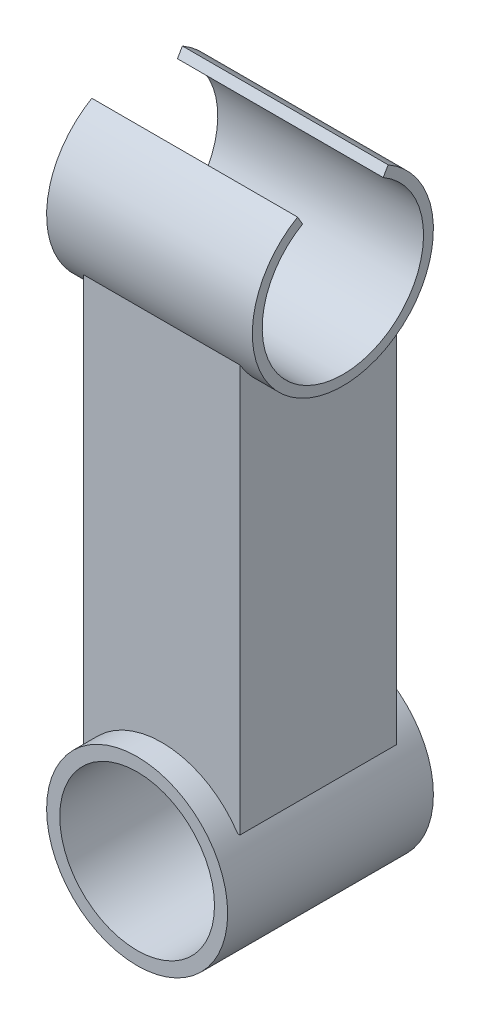
ISO-10303-21;
HEADER;
FILE_DESCRIPTION(('STEP AP214'),'2;1');
FILE_NAME('part.step','',(''),(''),'','','');
FILE_SCHEMA(('AUTOMOTIVE_DESIGN { 1 0 10303 214 1 1 1 1 }'));
ENDSEC;
DATA;
#1=APPLICATION_CONTEXT('core data for automotive mechanical design processes');
#2=APPLICATION_PROTOCOL_DEFINITION('international standard','automotive_design',2000,#1);
#3=PRODUCT_CONTEXT('',#1,'mechanical');
#4=PRODUCT('Part','Part','',(#3));
#5=PRODUCT_RELATED_PRODUCT_CATEGORY('part','',(#4));
#6=PRODUCT_DEFINITION_FORMATION('','',#4);
#7=PRODUCT_DEFINITION_CONTEXT('part definition',#1,'design');
#8=PRODUCT_DEFINITION('design','',#6,#7);
#9=PRODUCT_DEFINITION_SHAPE('','',#8);
#10=(LENGTH_UNIT() NAMED_UNIT(*) SI_UNIT(.MILLI.,.METRE.));
#11=(NAMED_UNIT(*) PLANE_ANGLE_UNIT() SI_UNIT($,.RADIAN.));
#12=(NAMED_UNIT(*) SI_UNIT($,.STERADIAN.) SOLID_ANGLE_UNIT());
#13=UNCERTAINTY_MEASURE_WITH_UNIT(LENGTH_MEASURE(1.E-05),#10,'distance_accuracy_value','');
#14=(GEOMETRIC_REPRESENTATION_CONTEXT(3) GLOBAL_UNCERTAINTY_ASSIGNED_CONTEXT((#13)) GLOBAL_UNIT_ASSIGNED_CONTEXT((#10,
#11,#12)) REPRESENTATION_CONTEXT('',''));
#15=CARTESIAN_POINT('',(0.,0.,0.));
#16=DIRECTION('',(0.,0.,1.));
#17=DIRECTION('',(1.,0.,0.));
#18=AXIS2_PLACEMENT_3D('',#15,#16,#17);
#19=CARTESIAN_POINT('',(0.,-55.,0.));
#20=DIRECTION('',(0.,-1.,0.));
#21=DIRECTION('',(0.,0.,-1.));
#22=AXIS2_PLACEMENT_3D('',#19,#20,#21);
#23=PLANE('',#22);
#24=DIRECTION('',(-1.,0.,0.));
#25=VECTOR('',#24,1.);
#26=CARTESIAN_POINT('',(-9.5,-55.,-9.5));
#27=LINE('',#26,#25);
#28=CARTESIAN_POINT('',(-9.21954445729289,-55.,-9.5));
#29=VERTEX_POINT('',#28);
#30=CARTESIAN_POINT('',(-9.5,-55.,-9.5));
#31=VERTEX_POINT('',#30);
#32=EDGE_CURVE('E332',#29,#31,#27,.T.);
#33=ORIENTED_EDGE('',*,*,#32,.F.);
#34=DIRECTION('',(0.,0.,-1.));
#35=VECTOR('',#34,1.);
#36=CARTESIAN_POINT('',(-9.21954445729289,-55.,12.5));
#37=LINE('',#36,#35);
#38=CARTESIAN_POINT('',(-9.21954445729289,-55.,9.5));
#39=VERTEX_POINT('',#38);
#40=EDGE_CURVE('E11',#29,#39,#37,.F.);
#41=ORIENTED_EDGE('',*,*,#40,.T.);
#42=DIRECTION('',(1.,0.,0.));
#43=VECTOR('',#42,1.);
#44=CARTESIAN_POINT('',(-9.5,-55.,9.5));
#45=LINE('',#44,#43);
#46=CARTESIAN_POINT('',(-9.5,-55.,9.5));
#47=VERTEX_POINT('',#46);
#48=EDGE_CURVE('E166',#47,#39,#45,.T.);
#49=ORIENTED_EDGE('',*,*,#48,.F.);
#50=DIRECTION('',(0.,0.,1.));
#51=VECTOR('',#50,1.);
#52=CARTESIAN_POINT('',(-9.5,-55.,9.5));
#53=LINE('',#52,#51);
#54=EDGE_CURVE('E175',#31,#47,#53,.T.);
#55=ORIENTED_EDGE('',*,*,#54,.F.);
#56=EDGE_LOOP('',(#33,#41,#49,#55));
#57=FACE_BOUND('',#56,.T.);
#58=ADVANCED_FACE('F44',(#57),#23,.T.);
#59=CARTESIAN_POINT('',(9.21954445729289,-55.,9.5));
#60=VERTEX_POINT('',#59);
#61=CARTESIAN_POINT('',(9.5,-55.,9.5));
#62=VERTEX_POINT('',#61);
#63=EDGE_CURVE('E163',#60,#62,#45,.T.);
#64=ORIENTED_EDGE('',*,*,#63,.F.);
#65=DIRECTION('',(0.,0.,-1.));
#66=VECTOR('',#65,1.);
#67=CARTESIAN_POINT('',(9.21954445729289,-55.,12.5));
#68=LINE('',#67,#66);
#69=CARTESIAN_POINT('',(9.21954445729289,-55.,-9.5));
#70=VERTEX_POINT('',#69);
#71=EDGE_CURVE('E54',#60,#70,#68,.T.);
#72=ORIENTED_EDGE('',*,*,#71,.T.);
#73=CARTESIAN_POINT('',(9.5,-55.,-9.5));
#74=VERTEX_POINT('',#73);
#75=EDGE_CURVE('E181',#74,#70,#27,.T.);
#76=ORIENTED_EDGE('',*,*,#75,.F.);
#77=DIRECTION('',(0.,0.,-1.));
#78=VECTOR('',#77,1.);
#79=CARTESIAN_POINT('',(9.5,-55.,9.5));
#80=LINE('',#79,#78);
#81=EDGE_CURVE('E173',#62,#74,#80,.T.);
#82=ORIENTED_EDGE('',*,*,#81,.F.);
#83=EDGE_LOOP('',(#64,#72,#76,#82));
#84=FACE_BOUND('',#83,.T.);
#85=ADVANCED_FACE('F171',(#84),#23,.T.);
#86=CARTESIAN_POINT('',(12.5,0.,0.));
#87=DIRECTION('',(-1.,0.,0.));
#88=DIRECTION('',(0.,0.,1.));
#89=AXIS2_PLACEMENT_3D('',#86,#87,#88);
#90=CYLINDRICAL_SURFACE('',#89,11.);
#91=DIRECTION('',(-1.,0.,0.));
#92=VECTOR('',#91,1.);
#93=CARTESIAN_POINT('',(12.5,-5.54526825320471,9.5));
#94=LINE('',#93,#92);
#95=CARTESIAN_POINT('',(-9.5,-5.54526825320471,9.5));
#96=VERTEX_POINT('',#95);
#97=CARTESIAN_POINT('',(9.5,-5.54526825320471,9.5));
#98=VERTEX_POINT('',#97);
#99=EDGE_CURVE('E222',#96,#98,#94,.F.);
#100=ORIENTED_EDGE('',*,*,#99,.T.);
#101=CARTESIAN_POINT('',(9.5,0.,0.));
#102=DIRECTION('',(1.,0.,0.));
#103=DIRECTION('',(0.,0.,-1.));
#104=AXIS2_PLACEMENT_3D('',#101,#102,#103);
#105=CIRCLE('',#104,11.);
#106=CARTESIAN_POINT('',(9.5,-5.54526825320471,-9.5));
#107=VERTEX_POINT('',#106);
#108=EDGE_CURVE('E226',#98,#107,#105,.T.);
#109=ORIENTED_EDGE('',*,*,#108,.T.);
#110=DIRECTION('',(-1.,0.,0.));
#111=VECTOR('',#110,1.);
#112=CARTESIAN_POINT('',(12.5,-5.54526825320471,-9.5));
#113=LINE('',#112,#111);
#114=CARTESIAN_POINT('',(-9.5,-5.54526825320471,-9.5));
#115=VERTEX_POINT('',#114);
#116=EDGE_CURVE('E214',#107,#115,#113,.T.);
#117=ORIENTED_EDGE('',*,*,#116,.T.);
#118=CARTESIAN_POINT('',(-9.5,0.,0.));
#119=DIRECTION('',(-1.,0.,0.));
#120=DIRECTION('',(0.,0.,1.));
#121=AXIS2_PLACEMENT_3D('',#118,#119,#120);
#122=CIRCLE('',#121,11.);
#123=EDGE_CURVE('E218',#115,#96,#122,.T.);
#124=ORIENTED_EDGE('',*,*,#123,.T.);
#125=EDGE_LOOP('',(#100,#109,#117,#124));
#126=FACE_BOUND('',#125,.T.);
#127=CARTESIAN_POINT('',(-12.5,0.,0.));
#128=DIRECTION('',(1.,0.,0.));
#129=DIRECTION('',(0.,0.,-1.));
#130=AXIS2_PLACEMENT_3D('',#127,#128,#129);
#131=CIRCLE('',#130,11.);
#132=CARTESIAN_POINT('',(-12.5,9.52627944162886,5.49999999999994));
#133=VERTEX_POINT('',#132);
#134=CARTESIAN_POINT('',(-12.5,9.52627944162882,-5.50000000000001));
#135=VERTEX_POINT('',#134);
#136=EDGE_CURVE('E230',#133,#135,#131,.T.);
#137=ORIENTED_EDGE('',*,*,#136,.T.);
#138=DIRECTION('',(-1.,0.,0.));
#139=VECTOR('',#138,1.);
#140=CARTESIAN_POINT('',(12.5,9.52627944162882,-5.50000000000001));
#141=LINE('',#140,#139);
#142=CARTESIAN_POINT('',(12.5,9.52627944162882,-5.50000000000001));
#143=VERTEX_POINT('',#142);
#144=EDGE_CURVE('E158',#143,#135,#141,.T.);
#145=ORIENTED_EDGE('',*,*,#144,.F.);
#146=CARTESIAN_POINT('',(12.5,0.,0.));
#147=DIRECTION('',(1.,0.,0.));
#148=DIRECTION('',(0.,0.,-1.));
#149=AXIS2_PLACEMENT_3D('',#146,#147,#148);
#150=CIRCLE('',#149,11.);
#151=CARTESIAN_POINT('',(12.5,9.52627944162886,5.49999999999994));
#152=VERTEX_POINT('',#151);
#153=EDGE_CURVE('E231',#152,#143,#150,.T.);
#154=ORIENTED_EDGE('',*,*,#153,.F.);
#155=DIRECTION('',(-1.,0.,0.));
#156=VECTOR('',#155,1.);
#157=CARTESIAN_POINT('',(12.5,9.52627944162886,5.49999999999994));
#158=LINE('',#157,#156);
#159=EDGE_CURVE('E245',#152,#133,#158,.T.);
#160=ORIENTED_EDGE('',*,*,#159,.T.);
#161=EDGE_LOOP('',(#137,#145,#154,#160));
#162=FACE_BOUND('',#161,.T.);
#163=ADVANCED_FACE('F46',(#126,#162),#90,.T.);
#164=CARTESIAN_POINT('',(12.5,8.48704895708749,-4.90000000000001));
#165=DIRECTION('',(0.,-0.500000000000001,-0.866025403784438));
#166=DIRECTION('',(0.,0.866025403784438,-0.500000000000001));
#167=AXIS2_PLACEMENT_3D('',#164,#165,#166);
#168=PLANE('',#167);
#169=DIRECTION('',(0.,-0.866025403784438,0.500000000000001));
#170=VECTOR('',#169,1.);
#171=CARTESIAN_POINT('',(-12.5,8.48704895708749,-4.90000000000001));
#172=LINE('',#171,#170);
#173=CARTESIAN_POINT('',(-12.5,8.48704895708749,-4.90000000000001));
#174=VERTEX_POINT('',#173);
#175=EDGE_CURVE('E249',#135,#174,#172,.T.);
#176=ORIENTED_EDGE('',*,*,#175,.T.);
#177=DIRECTION('',(-1.,0.,0.));
#178=VECTOR('',#177,1.);
#179=CARTESIAN_POINT('',(12.5,8.48704895708749,-4.90000000000001));
#180=LINE('',#179,#178);
#181=CARTESIAN_POINT('',(12.5,8.48704895708749,-4.90000000000001));
#182=VERTEX_POINT('',#181);
#183=EDGE_CURVE('E264',#182,#174,#180,.T.);
#184=ORIENTED_EDGE('',*,*,#183,.F.);
#185=DIRECTION('',(0.,-0.866025403784438,0.500000000000001));
#186=VECTOR('',#185,1.);
#187=CARTESIAN_POINT('',(12.5,8.48704895708749,-4.90000000000001));
#188=LINE('',#187,#186);
#189=EDGE_CURVE('E235',#143,#182,#188,.T.);
#190=ORIENTED_EDGE('',*,*,#189,.F.);
#191=ORIENTED_EDGE('',*,*,#144,.T.);
#192=EDGE_LOOP('',(#176,#184,#190,#191));
#193=FACE_BOUND('',#192,.T.);
#194=ADVANCED_FACE('F272',(#193),#168,.F.);
#195=CARTESIAN_POINT('',(12.5,0.,0.));
#196=DIRECTION('',(-1.,0.,0.));
#197=DIRECTION('',(0.,0.,1.));
#198=AXIS2_PLACEMENT_3D('',#195,#196,#197);
#199=CYLINDRICAL_SURFACE('',#198,9.8);
#200=CARTESIAN_POINT('',(-12.5,0.,0.));
#201=DIRECTION('',(-1.,0.,0.));
#202=DIRECTION('',(0.,0.,-1.));
#203=AXIS2_PLACEMENT_3D('',#200,#201,#202);
#204=CIRCLE('',#203,9.8);
#205=CARTESIAN_POINT('',(-12.5,8.48704895708753,4.89999999999995));
#206=VERTEX_POINT('',#205);
#207=EDGE_CURVE('E252',#174,#206,#204,.T.);
#208=ORIENTED_EDGE('',*,*,#207,.T.);
#209=DIRECTION('',(-1.,0.,0.));
#210=VECTOR('',#209,1.);
#211=CARTESIAN_POINT('',(12.5,8.48704895708753,4.89999999999995));
#212=LINE('',#211,#210);
#213=CARTESIAN_POINT('',(12.5,8.48704895708753,4.89999999999995));
#214=VERTEX_POINT('',#213);
#215=EDGE_CURVE('E260',#214,#206,#212,.T.);
#216=ORIENTED_EDGE('',*,*,#215,.F.);
#217=CARTESIAN_POINT('',(12.5,0.,0.));
#218=DIRECTION('',(-1.,0.,0.));
#219=DIRECTION('',(0.,0.,-1.));
#220=AXIS2_PLACEMENT_3D('',#217,#218,#219);
#221=CIRCLE('',#220,9.8);
#222=EDGE_CURVE('E239',#182,#214,#221,.T.);
#223=ORIENTED_EDGE('',*,*,#222,.F.);
#224=ORIENTED_EDGE('',*,*,#183,.T.);
#225=EDGE_LOOP('',(#208,#216,#223,#224));
#226=FACE_BOUND('',#225,.T.);
#227=ADVANCED_FACE('F284',(#226),#199,.F.);
#228=CARTESIAN_POINT('',(12.5,9.52627944162886,5.49999999999994));
#229=DIRECTION('',(0.,-0.499999999999994,0.866025403784442));
#230=DIRECTION('',(0.,-0.866025403784442,-0.499999999999995));
#231=AXIS2_PLACEMENT_3D('',#228,#229,#230);
#232=PLANE('',#231);
#233=DIRECTION('',(0.,0.866025403784442,0.499999999999994));
#234=VECTOR('',#233,1.);
#235=CARTESIAN_POINT('',(-12.5,9.52627944162886,5.49999999999994));
#236=LINE('',#235,#234);
#237=EDGE_CURVE('E236',#206,#133,#236,.T.);
#238=ORIENTED_EDGE('',*,*,#237,.T.);
#239=ORIENTED_EDGE('',*,*,#159,.F.);
#240=DIRECTION('',(0.,0.866025403784442,0.499999999999994));
#241=VECTOR('',#240,1.);
#242=CARTESIAN_POINT('',(12.5,9.52627944162886,5.49999999999994));
#243=LINE('',#242,#241);
#244=EDGE_CURVE('E242',#214,#152,#243,.T.);
#245=ORIENTED_EDGE('',*,*,#244,.F.);
#246=ORIENTED_EDGE('',*,*,#215,.T.);
#247=EDGE_LOOP('',(#238,#239,#245,#246));
#248=FACE_BOUND('',#247,.T.);
#249=ADVANCED_FACE('F288',(#248),#232,.F.);
#250=CARTESIAN_POINT('',(12.5,0.,0.));
#251=DIRECTION('',(1.,0.,0.));
#252=DIRECTION('',(0.,0.,-1.));
#253=AXIS2_PLACEMENT_3D('',#250,#251,#252);
#254=PLANE('',#253);
#255=ORIENTED_EDGE('',*,*,#153,.T.);
#256=ORIENTED_EDGE('',*,*,#189,.T.);
#257=ORIENTED_EDGE('',*,*,#222,.T.);
#258=ORIENTED_EDGE('',*,*,#244,.T.);
#259=EDGE_LOOP('',(#255,#256,#257,#258));
#260=FACE_BOUND('',#259,.T.);
#261=ADVANCED_FACE('F290',(#260),#254,.T.);
#262=CARTESIAN_POINT('',(-12.5,0.,0.));
#263=DIRECTION('',(1.,0.,0.));
#264=DIRECTION('',(0.,0.,-1.));
#265=AXIS2_PLACEMENT_3D('',#262,#263,#264);
#266=PLANE('',#265);
#267=ORIENTED_EDGE('',*,*,#136,.F.);
#268=ORIENTED_EDGE('',*,*,#237,.F.);
#269=ORIENTED_EDGE('',*,*,#207,.F.);
#270=ORIENTED_EDGE('',*,*,#175,.F.);
#271=EDGE_LOOP('',(#267,#268,#269,#270));
#272=FACE_BOUND('',#271,.T.);
#273=ADVANCED_FACE('F280',(#272),#266,.F.);
#274=CARTESIAN_POINT('',(9.5,-55.,9.5));
#275=DIRECTION('',(1.,0.,0.));
#276=DIRECTION('',(0.,0.,-1.));
#277=AXIS2_PLACEMENT_3D('',#274,#275,#276);
#278=PLANE('',#277);
#279=ORIENTED_EDGE('',*,*,#108,.F.);
#280=DIRECTION('',(0.,1.,0.));
#281=VECTOR('',#280,1.);
#282=CARTESIAN_POINT('',(9.5,-55.,9.5));
#283=LINE('',#282,#281);
#284=EDGE_CURVE('E185',#62,#98,#283,.T.);
#285=ORIENTED_EDGE('',*,*,#284,.F.);
#286=ORIENTED_EDGE('',*,*,#81,.T.);
#287=DIRECTION('',(0.,1.,0.));
#288=VECTOR('',#287,1.);
#289=CARTESIAN_POINT('',(9.5,-55.,-9.5));
#290=LINE('',#289,#288);
#291=EDGE_CURVE('E179',#74,#107,#290,.T.);
#292=ORIENTED_EDGE('',*,*,#291,.T.);
#293=EDGE_LOOP('',(#279,#285,#286,#292));
#294=FACE_BOUND('',#293,.T.);
#295=ADVANCED_FACE('F297',(#294),#278,.T.);
#296=CARTESIAN_POINT('',(-9.5,-55.,9.5));
#297=DIRECTION('',(0.,0.,1.));
#298=DIRECTION('',(1.,0.,0.));
#299=AXIS2_PLACEMENT_3D('',#296,#297,#298);
#300=PLANE('',#299);
#301=ORIENTED_EDGE('',*,*,#48,.T.);
#302=CARTESIAN_POINT('',(0.,-61.,9.5));
#303=DIRECTION('',(0.,0.,1.));
#304=DIRECTION('',(1.,0.,0.));
#305=AXIS2_PLACEMENT_3D('',#302,#303,#304);
#306=CIRCLE('',#305,11.);
#307=EDGE_CURVE('E150',#39,#60,#306,.F.);
#308=ORIENTED_EDGE('',*,*,#307,.T.);
#309=ORIENTED_EDGE('',*,*,#63,.T.);
#310=ORIENTED_EDGE('',*,*,#284,.T.);
#311=ORIENTED_EDGE('',*,*,#99,.F.);
#312=DIRECTION('',(0.,1.,0.));
#313=VECTOR('',#312,1.);
#314=CARTESIAN_POINT('',(-9.5,-55.,9.5));
#315=LINE('',#314,#313);
#316=EDGE_CURVE('E189',#47,#96,#315,.T.);
#317=ORIENTED_EDGE('',*,*,#316,.F.);
#318=EDGE_LOOP('',(#301,#308,#309,#310,#311,#317));
#319=FACE_BOUND('',#318,.T.);
#320=ADVANCED_FACE('F161',(#319),#300,.T.);
#321=CARTESIAN_POINT('',(-9.5,-55.,9.5));
#322=DIRECTION('',(-1.,0.,0.));
#323=DIRECTION('',(0.,0.,1.));
#324=AXIS2_PLACEMENT_3D('',#321,#322,#323);
#325=PLANE('',#324);
#326=ORIENTED_EDGE('',*,*,#123,.F.);
#327=DIRECTION('',(0.,1.,0.));
#328=VECTOR('',#327,1.);
#329=CARTESIAN_POINT('',(-9.5,-55.,-9.5));
#330=LINE('',#329,#328);
#331=EDGE_CURVE('E193',#31,#115,#330,.T.);
#332=ORIENTED_EDGE('',*,*,#331,.F.);
#333=ORIENTED_EDGE('',*,*,#54,.T.);
#334=ORIENTED_EDGE('',*,*,#316,.T.);
#335=EDGE_LOOP('',(#326,#332,#333,#334));
#336=FACE_BOUND('',#335,.T.);
#337=ADVANCED_FACE('F315',(#336),#325,.T.);
#338=CARTESIAN_POINT('',(-9.5,-55.,-9.5));
#339=DIRECTION('',(0.,0.,-1.));
#340=DIRECTION('',(-1.,0.,0.));
#341=AXIS2_PLACEMENT_3D('',#338,#339,#340);
#342=PLANE('',#341);
#343=ORIENTED_EDGE('',*,*,#75,.T.);
#344=CARTESIAN_POINT('',(0.,-61.,-9.5));
#345=DIRECTION('',(0.,0.,-1.));
#346=DIRECTION('',(-1.,0.,0.));
#347=AXIS2_PLACEMENT_3D('',#344,#345,#346);
#348=CIRCLE('',#347,11.);
#349=EDGE_CURVE('E152',#70,#29,#348,.F.);
#350=ORIENTED_EDGE('',*,*,#349,.T.);
#351=ORIENTED_EDGE('',*,*,#32,.T.);
#352=ORIENTED_EDGE('',*,*,#331,.T.);
#353=ORIENTED_EDGE('',*,*,#116,.F.);
#354=ORIENTED_EDGE('',*,*,#291,.F.);
#355=EDGE_LOOP('',(#343,#350,#351,#352,#353,#354));
#356=FACE_BOUND('',#355,.T.);
#357=ADVANCED_FACE('F318',(#356),#342,.T.);
#358=CARTESIAN_POINT('',(0.,-61.,12.5));
#359=DIRECTION('',(0.,0.,-1.));
#360=DIRECTION('',(-1.,0.,0.));
#361=AXIS2_PLACEMENT_3D('',#358,#359,#360);
#362=CYLINDRICAL_SURFACE('',#361,9.4);
#363=CARTESIAN_POINT('',(0.,-61.,12.5));
#364=DIRECTION('',(0.,0.,1.));
#365=DIRECTION('',(1.,0.,0.));
#366=AXIS2_PLACEMENT_3D('',#363,#364,#365);
#367=CIRCLE('',#366,9.4);
#368=CARTESIAN_POINT('',(9.4,-61.,12.5));
#369=VERTEX_POINT('',#368);
#370=EDGE_CURVE('E418',#369,#369,#367,.T.);
#371=ORIENTED_EDGE('',*,*,#370,.T.);
#372=EDGE_LOOP('',(#371));
#373=FACE_BOUND('',#372,.T.);
#374=CARTESIAN_POINT('',(0.,-61.,-12.5));
#375=DIRECTION('',(0.,0.,1.));
#376=DIRECTION('',(1.,0.,0.));
#377=AXIS2_PLACEMENT_3D('',#374,#375,#376);
#378=CIRCLE('',#377,9.4);
#379=CARTESIAN_POINT('',(9.4,-61.,-12.5));
#380=VERTEX_POINT('',#379);
#381=EDGE_CURVE('E420',#380,#380,#378,.T.);
#382=ORIENTED_EDGE('',*,*,#381,.F.);
#383=EDGE_LOOP('',(#382));
#384=FACE_BOUND('',#383,.T.);
#385=ADVANCED_FACE('F321',(#373,#384),#362,.F.);
#386=CARTESIAN_POINT('',(0.,-61.,12.5));
#387=DIRECTION('',(0.,0.,-1.));
#388=DIRECTION('',(-1.,0.,0.));
#389=AXIS2_PLACEMENT_3D('',#386,#387,#388);
#390=CYLINDRICAL_SURFACE('',#389,11.);
#391=ORIENTED_EDGE('',*,*,#40,.F.);
#392=ORIENTED_EDGE('',*,*,#349,.F.);
#393=ORIENTED_EDGE('',*,*,#71,.F.);
#394=ORIENTED_EDGE('',*,*,#307,.F.);
#395=EDGE_LOOP('',(#391,#392,#393,#394));
#396=FACE_BOUND('',#395,.T.);
#397=CARTESIAN_POINT('',(0.,-61.,12.5));
#398=DIRECTION('',(0.,0.,1.));
#399=DIRECTION('',(1.,0.,0.));
#400=AXIS2_PLACEMENT_3D('',#397,#398,#399);
#401=CIRCLE('',#400,11.);
#402=CARTESIAN_POINT('',(11.,-61.,12.5));
#403=VERTEX_POINT('',#402);
#404=EDGE_CURVE('E334',#403,#403,#401,.T.);
#405=ORIENTED_EDGE('',*,*,#404,.F.);
#406=EDGE_LOOP('',(#405));
#407=FACE_BOUND('',#406,.T.);
#408=CARTESIAN_POINT('',(0.,-61.,-12.5));
#409=DIRECTION('',(0.,0.,1.));
#410=DIRECTION('',(1.,0.,0.));
#411=AXIS2_PLACEMENT_3D('',#408,#409,#410);
#412=CIRCLE('',#411,11.);
#413=CARTESIAN_POINT('',(11.,-61.,-12.5));
#414=VERTEX_POINT('',#413);
#415=EDGE_CURVE('E338',#414,#414,#412,.T.);
#416=ORIENTED_EDGE('',*,*,#415,.T.);
#417=EDGE_LOOP('',(#416));
#418=FACE_BOUND('',#417,.T.);
#419=ADVANCED_FACE('F148',(#396,#407,#418),#390,.T.);
#420=CARTESIAN_POINT('',(0.,-61.,-12.5));
#421=DIRECTION('',(0.,0.,1.));
#422=DIRECTION('',(1.,0.,0.));
#423=AXIS2_PLACEMENT_3D('',#420,#421,#422);
#424=PLANE('',#423);
#425=ORIENTED_EDGE('',*,*,#415,.F.);
#426=EDGE_LOOP('',(#425));
#427=FACE_BOUND('',#426,.T.);
#428=ORIENTED_EDGE('',*,*,#381,.T.);
#429=EDGE_LOOP('',(#428));
#430=FACE_BOUND('',#429,.T.);
#431=ADVANCED_FACE('F397',(#427,#430),#424,.F.);
#432=CARTESIAN_POINT('',(0.,-61.,12.5));
#433=DIRECTION('',(0.,0.,1.));
#434=DIRECTION('',(1.,0.,0.));
#435=AXIS2_PLACEMENT_3D('',#432,#433,#434);
#436=PLANE('',#435);
#437=ORIENTED_EDGE('',*,*,#404,.T.);
#438=EDGE_LOOP('',(#437));
#439=FACE_BOUND('',#438,.T.);
#440=ORIENTED_EDGE('',*,*,#370,.F.);
#441=EDGE_LOOP('',(#440));
#442=FACE_BOUND('',#441,.T.);
#443=ADVANCED_FACE('F401',(#439,#442),#436,.T.);
#444=CLOSED_SHELL('',(#58,#85,#163,#194,#227,#249,#261,#273,#295,#320,#337,#357,#385,#419,#431,#443));
#445=CARTESIAN_POINT('',(0.,-61.,-7.9));
#446=DIRECTION('',(0.,0.,-1.));
#447=DIRECTION('',(-1.,0.,0.));
#448=AXIS2_PLACEMENT_3D('',#445,#446,#447);
#449=CIRCLE('',#448,11.);
#450=CARTESIAN_POINT('',(7.9,-53.3455895066962,-7.9));
#451=VERTEX_POINT('',#450);
#452=CARTESIAN_POINT('',(-7.9,-53.3455895066962,-7.9));
#453=VERTEX_POINT('',#452);
#454=EDGE_CURVE('E68',#451,#453,#449,.F.);
#455=ORIENTED_EDGE('',*,*,#454,.T.);
#456=DIRECTION('',(0.,0.,-1.));
#457=VECTOR('',#456,1.);
#458=CARTESIAN_POINT('',(-7.9,-53.3455895066962,12.5));
#459=LINE('',#458,#457);
#460=CARTESIAN_POINT('',(-7.9,-53.3455895066962,7.9));
#461=VERTEX_POINT('',#460);
#462=EDGE_CURVE('E61',#453,#461,#459,.F.);
#463=ORIENTED_EDGE('',*,*,#462,.T.);
#464=CARTESIAN_POINT('',(0.,-61.,7.9));
#465=DIRECTION('',(0.,0.,1.));
#466=DIRECTION('',(1.,0.,0.));
#467=AXIS2_PLACEMENT_3D('',#464,#465,#466);
#468=CIRCLE('',#467,11.);
#469=CARTESIAN_POINT('',(7.9,-53.3455895066962,7.9));
#470=VERTEX_POINT('',#469);
#471=EDGE_CURVE('E168',#461,#470,#468,.F.);
#472=ORIENTED_EDGE('',*,*,#471,.T.);
#473=DIRECTION('',(0.,0.,-1.));
#474=VECTOR('',#473,1.);
#475=CARTESIAN_POINT('',(7.9,-53.3455895066962,12.5));
#476=LINE('',#475,#474);
#477=EDGE_CURVE('E345',#470,#451,#476,.T.);
#478=ORIENTED_EDGE('',*,*,#477,.T.);
#479=EDGE_LOOP('',(#455,#463,#472,#478));
#480=FACE_BOUND('',#479,.T.);
#481=ADVANCED_FACE('F378',(#480),#390,.T.);
#482=CARTESIAN_POINT('',(-7.9,0.,0.));
#483=DIRECTION('',(-1.,0.,0.));
#484=DIRECTION('',(0.,0.,1.));
#485=AXIS2_PLACEMENT_3D('',#482,#483,#484);
#486=CIRCLE('',#485,11.);
#487=CARTESIAN_POINT('',(-7.9,-7.65441049330384,-7.9));
#488=VERTEX_POINT('',#487);
#489=CARTESIAN_POINT('',(-7.9,-7.65441049330384,7.9));
#490=VERTEX_POINT('',#489);
#491=EDGE_CURVE('E210',#488,#490,#486,.T.);
#492=ORIENTED_EDGE('',*,*,#491,.F.);
#493=DIRECTION('',(-1.,0.,0.));
#494=VECTOR('',#493,1.);
#495=CARTESIAN_POINT('',(12.5,-7.65441049330384,-7.9));
#496=LINE('',#495,#494);
#497=CARTESIAN_POINT('',(7.9,-7.65441049330384,-7.9));
#498=VERTEX_POINT('',#497);
#499=EDGE_CURVE('E206',#498,#488,#496,.T.);
#500=ORIENTED_EDGE('',*,*,#499,.F.);
#501=CARTESIAN_POINT('',(7.9,0.,0.));
#502=DIRECTION('',(1.,0.,0.));
#503=DIRECTION('',(0.,0.,-1.));
#504=AXIS2_PLACEMENT_3D('',#501,#502,#503);
#505=CIRCLE('',#504,11.);
#506=CARTESIAN_POINT('',(7.9,-7.65441049330384,7.9));
#507=VERTEX_POINT('',#506);
#508=EDGE_CURVE('E202',#507,#498,#505,.T.);
#509=ORIENTED_EDGE('',*,*,#508,.F.);
#510=DIRECTION('',(-1.,0.,0.));
#511=VECTOR('',#510,1.);
#512=CARTESIAN_POINT('',(12.5,-7.65441049330384,7.9));
#513=LINE('',#512,#511);
#514=EDGE_CURVE('E188',#490,#507,#513,.F.);
#515=ORIENTED_EDGE('',*,*,#514,.F.);
#516=EDGE_LOOP('',(#492,#500,#509,#515));
#517=FACE_BOUND('',#516,.T.);
#518=ADVANCED_FACE('F374',(#517),#90,.T.);
#519=CARTESIAN_POINT('',(-7.9,-55.,7.9));
#520=DIRECTION('',(0.,0.,1.));
#521=DIRECTION('',(1.,0.,0.));
#522=AXIS2_PLACEMENT_3D('',#519,#520,#521);
#523=PLANE('',#522);
#524=ORIENTED_EDGE('',*,*,#471,.F.);
#525=DIRECTION('',(0.,1.,0.));
#526=VECTOR('',#525,1.);
#527=CARTESIAN_POINT('',(-7.9,-55.,7.9));
#528=LINE('',#527,#526);
#529=EDGE_CURVE('E353',#461,#490,#528,.T.);
#530=ORIENTED_EDGE('',*,*,#529,.T.);
#531=ORIENTED_EDGE('',*,*,#514,.T.);
#532=DIRECTION('',(0.,1.,0.));
#533=VECTOR('',#532,1.);
#534=CARTESIAN_POINT('',(7.9,-55.,7.9));
#535=LINE('',#534,#533);
#536=EDGE_CURVE('E360',#470,#507,#535,.T.);
#537=ORIENTED_EDGE('',*,*,#536,.F.);
#538=EDGE_LOOP('',(#524,#530,#531,#537));
#539=FACE_BOUND('',#538,.T.);
#540=ADVANCED_FACE('F370',(#539),#523,.F.);
#541=CARTESIAN_POINT('',(7.9,-55.,7.9));
#542=DIRECTION('',(1.,0.,0.));
#543=DIRECTION('',(0.,0.,-1.));
#544=AXIS2_PLACEMENT_3D('',#541,#542,#543);
#545=PLANE('',#544);
#546=ORIENTED_EDGE('',*,*,#477,.F.);
#547=ORIENTED_EDGE('',*,*,#536,.T.);
#548=ORIENTED_EDGE('',*,*,#508,.T.);
#549=DIRECTION('',(0.,1.,0.));
#550=VECTOR('',#549,1.);
#551=CARTESIAN_POINT('',(7.9,-55.,-7.9));
#552=LINE('',#551,#550);
#553=EDGE_CURVE('E357',#451,#498,#552,.T.);
#554=ORIENTED_EDGE('',*,*,#553,.F.);
#555=EDGE_LOOP('',(#546,#547,#548,#554));
#556=FACE_BOUND('',#555,.T.);
#557=ADVANCED_FACE('F381',(#556),#545,.F.);
#558=CARTESIAN_POINT('',(-7.9,-55.,-7.9));
#559=DIRECTION('',(0.,0.,-1.));
#560=DIRECTION('',(-1.,0.,0.));
#561=AXIS2_PLACEMENT_3D('',#558,#559,#560);
#562=PLANE('',#561);
#563=ORIENTED_EDGE('',*,*,#454,.F.);
#564=ORIENTED_EDGE('',*,*,#553,.T.);
#565=ORIENTED_EDGE('',*,*,#499,.T.);
#566=DIRECTION('',(0.,1.,0.));
#567=VECTOR('',#566,1.);
#568=CARTESIAN_POINT('',(-7.9,-55.,-7.9));
#569=LINE('',#568,#567);
#570=EDGE_CURVE('E354',#453,#488,#569,.T.);
#571=ORIENTED_EDGE('',*,*,#570,.F.);
#572=EDGE_LOOP('',(#563,#564,#565,#571));
#573=FACE_BOUND('',#572,.T.);
#574=ADVANCED_FACE('F376',(#573),#562,.F.);
#575=CARTESIAN_POINT('',(-7.9,-55.,7.9));
#576=DIRECTION('',(-1.,0.,0.));
#577=DIRECTION('',(0.,0.,1.));
#578=AXIS2_PLACEMENT_3D('',#575,#576,#577);
#579=PLANE('',#578);
#580=ORIENTED_EDGE('',*,*,#462,.F.);
#581=ORIENTED_EDGE('',*,*,#570,.T.);
#582=ORIENTED_EDGE('',*,*,#491,.T.);
#583=ORIENTED_EDGE('',*,*,#529,.F.);
#584=EDGE_LOOP('',(#580,#581,#582,#583));
#585=FACE_BOUND('',#584,.T.);
#586=ADVANCED_FACE('F311',(#585),#579,.F.);
#587=CLOSED_SHELL('',(#481,#518,#540,#557,#574,#586));
#588=ORIENTED_CLOSED_SHELL('',*,#587,.T.);
#589=BREP_WITH_VOIDS('B2',#444,(#588));
#590=ADVANCED_BREP_SHAPE_REPRESENTATION('',(#18,#589),#14);
#591=SHAPE_DEFINITION_REPRESENTATION(#9,#590);
ENDSEC;
END-ISO-10303-21;
